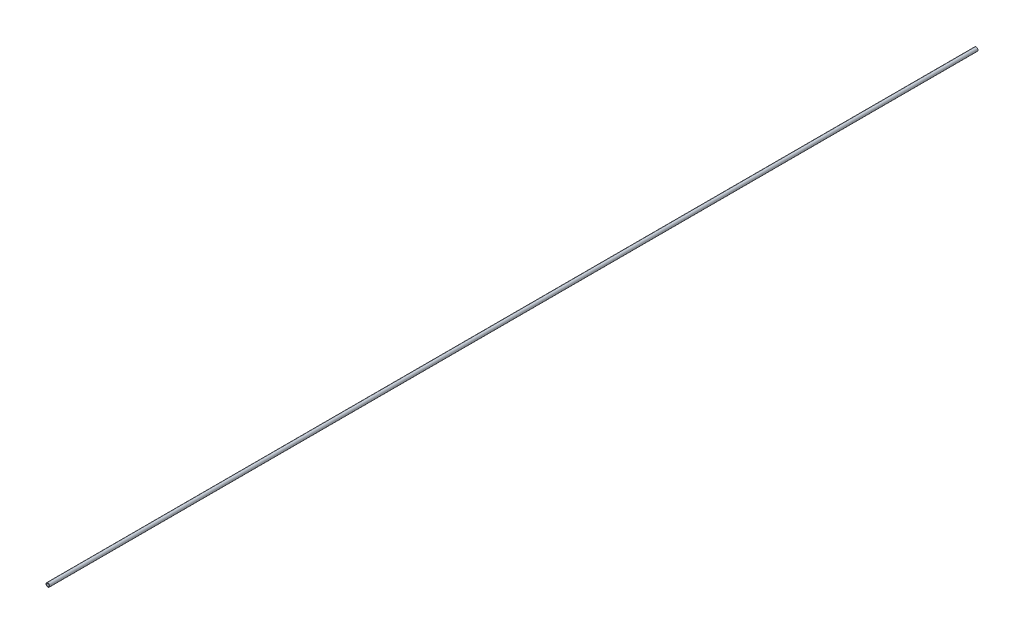
ISO-10303-21;
HEADER;
FILE_DESCRIPTION(('STEP AP214'),'2;1');
FILE_NAME('part.step','',(''),(''),'','','');
FILE_SCHEMA(('AUTOMOTIVE_DESIGN { 1 0 10303 214 1 1 1 1 }'));
ENDSEC;
DATA;
#1=APPLICATION_CONTEXT('core data for automotive mechanical design processes');
#2=APPLICATION_PROTOCOL_DEFINITION('international standard','automotive_design',2000,#1);
#3=PRODUCT_CONTEXT('',#1,'mechanical');
#4=PRODUCT('Part','Part','',(#3));
#5=PRODUCT_RELATED_PRODUCT_CATEGORY('part','',(#4));
#6=PRODUCT_DEFINITION_FORMATION('','',#4);
#7=PRODUCT_DEFINITION_CONTEXT('part definition',#1,'design');
#8=PRODUCT_DEFINITION('design','',#6,#7);
#9=PRODUCT_DEFINITION_SHAPE('','',#8);
#10=(LENGTH_UNIT() NAMED_UNIT(*) SI_UNIT(.MILLI.,.METRE.));
#11=(NAMED_UNIT(*) PLANE_ANGLE_UNIT() SI_UNIT($,.RADIAN.));
#12=(NAMED_UNIT(*) SI_UNIT($,.STERADIAN.) SOLID_ANGLE_UNIT());
#13=UNCERTAINTY_MEASURE_WITH_UNIT(LENGTH_MEASURE(1.E-05),#10,'distance_accuracy_value','');
#14=(GEOMETRIC_REPRESENTATION_CONTEXT(3) GLOBAL_UNCERTAINTY_ASSIGNED_CONTEXT((#13)) GLOBAL_UNIT_ASSIGNED_CONTEXT((#10,
#11,#12)) REPRESENTATION_CONTEXT('',''));
#15=CARTESIAN_POINT('',(0.,0.,0.));
#16=DIRECTION('',(0.,0.,1.));
#17=DIRECTION('',(1.,0.,0.));
#18=AXIS2_PLACEMENT_3D('',#15,#16,#17);
#19=CARTESIAN_POINT('',(0.,0.,1500.));
#20=DIRECTION('',(0.,0.,1.));
#21=DIRECTION('',(1.,0.,0.));
#22=AXIS2_PLACEMENT_3D('',#19,#20,#21);
#23=PLANE('',#22);
#24=CARTESIAN_POINT('',(0.,0.,1500.));
#25=DIRECTION('',(0.,0.,1.));
#26=DIRECTION('',(1.,0.,0.));
#27=AXIS2_PLACEMENT_3D('',#24,#25,#26);
#28=CIRCLE('',#27,3.);
#29=CARTESIAN_POINT('',(3.,0.,1500.));
#30=VERTEX_POINT('',#29);
#31=EDGE_CURVE('E10',#30,#30,#28,.T.);
#32=ORIENTED_EDGE('',*,*,#31,.T.);
#33=EDGE_LOOP('',(#32));
#34=FACE_BOUND('',#33,.T.);
#35=CARTESIAN_POINT('',(0.,0.,1500.));
#36=DIRECTION('',(0.,0.,1.));
#37=DIRECTION('',(1.,0.,0.));
#38=AXIS2_PLACEMENT_3D('',#35,#36,#37);
#39=CIRCLE('',#38,2.);
#40=CARTESIAN_POINT('',(2.,0.,1500.));
#41=VERTEX_POINT('',#40);
#42=EDGE_CURVE('E50',#41,#41,#39,.T.);
#43=ORIENTED_EDGE('',*,*,#42,.F.);
#44=EDGE_LOOP('',(#43));
#45=FACE_BOUND('',#44,.T.);
#46=ADVANCED_FACE('F39',(#34,#45),#23,.T.);
#47=CARTESIAN_POINT('',(0.,0.,0.));
#48=DIRECTION('',(0.,0.,1.));
#49=DIRECTION('',(1.,0.,0.));
#50=AXIS2_PLACEMENT_3D('',#47,#48,#49);
#51=PLANE('',#50);
#52=CARTESIAN_POINT('',(0.,0.,0.));
#53=DIRECTION('',(0.,0.,1.));
#54=DIRECTION('',(1.,0.,0.));
#55=AXIS2_PLACEMENT_3D('',#52,#53,#54);
#56=CIRCLE('',#55,3.);
#57=CARTESIAN_POINT('',(3.,0.,0.));
#58=VERTEX_POINT('',#57);
#59=EDGE_CURVE('E43',#58,#58,#56,.T.);
#60=ORIENTED_EDGE('',*,*,#59,.F.);
#61=EDGE_LOOP('',(#60));
#62=FACE_BOUND('',#61,.T.);
#63=CARTESIAN_POINT('',(0.,0.,0.));
#64=DIRECTION('',(0.,0.,1.));
#65=DIRECTION('',(1.,0.,0.));
#66=AXIS2_PLACEMENT_3D('',#63,#64,#65);
#67=CIRCLE('',#66,2.);
#68=CARTESIAN_POINT('',(2.,0.,0.));
#69=VERTEX_POINT('',#68);
#70=EDGE_CURVE('E52',#69,#69,#67,.T.);
#71=ORIENTED_EDGE('',*,*,#70,.T.);
#72=EDGE_LOOP('',(#71));
#73=FACE_BOUND('',#72,.T.);
#74=ADVANCED_FACE('F62',(#62,#73),#51,.F.);
#75=CARTESIAN_POINT('',(0.,0.,1500.));
#76=DIRECTION('',(0.,0.,-1.));
#77=DIRECTION('',(-1.,0.,0.));
#78=AXIS2_PLACEMENT_3D('',#75,#76,#77);
#79=CYLINDRICAL_SURFACE('',#78,3.);
#80=ORIENTED_EDGE('',*,*,#31,.F.);
#81=EDGE_LOOP('',(#80));
#82=FACE_BOUND('',#81,.T.);
#83=ORIENTED_EDGE('',*,*,#59,.T.);
#84=EDGE_LOOP('',(#83));
#85=FACE_BOUND('',#84,.T.);
#86=ADVANCED_FACE('F41',(#82,#85),#79,.T.);
#87=CARTESIAN_POINT('',(0.,0.,1500.));
#88=DIRECTION('',(0.,0.,-1.));
#89=DIRECTION('',(-1.,0.,0.));
#90=AXIS2_PLACEMENT_3D('',#87,#88,#89);
#91=CYLINDRICAL_SURFACE('',#90,2.);
#92=ORIENTED_EDGE('',*,*,#42,.T.);
#93=EDGE_LOOP('',(#92));
#94=FACE_BOUND('',#93,.T.);
#95=ORIENTED_EDGE('',*,*,#70,.F.);
#96=EDGE_LOOP('',(#95));
#97=FACE_BOUND('',#96,.T.);
#98=ADVANCED_FACE('F58',(#94,#97),#91,.F.);
#99=CLOSED_SHELL('',(#46,#74,#86,#98));
#100=MANIFOLD_SOLID_BREP('B2',#99);
#101=ADVANCED_BREP_SHAPE_REPRESENTATION('',(#18,#100),#14);
#102=SHAPE_DEFINITION_REPRESENTATION(#9,#101);
ENDSEC;
END-ISO-10303-21;
